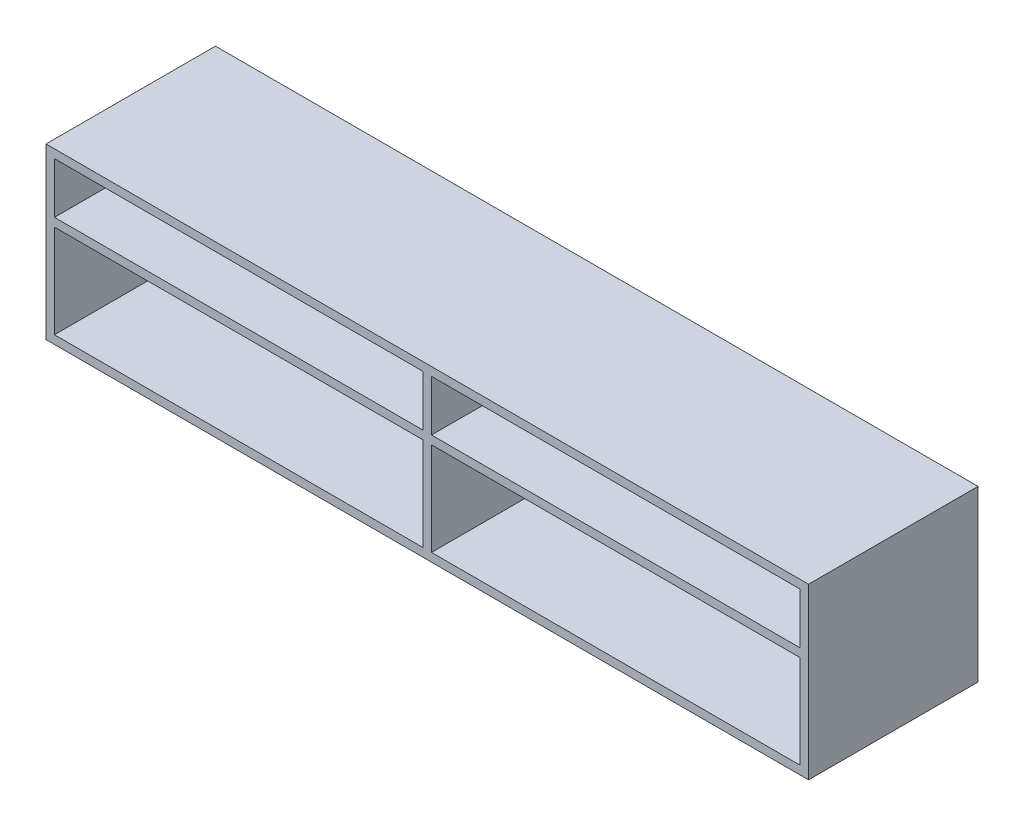
ISO-10303-21;
HEADER;
FILE_DESCRIPTION(('STEP AP214'),'2;1');
FILE_NAME('part.step','',(''),(''),'','','');
FILE_SCHEMA(('AUTOMOTIVE_DESIGN { 1 0 10303 214 1 1 1 1 }'));
ENDSEC;
DATA;
#1=APPLICATION_CONTEXT('core data for automotive mechanical design processes');
#2=APPLICATION_PROTOCOL_DEFINITION('international standard','automotive_design',2000,#1);
#3=PRODUCT_CONTEXT('',#1,'mechanical');
#4=PRODUCT('Part','Part','',(#3));
#5=PRODUCT_RELATED_PRODUCT_CATEGORY('part','',(#4));
#6=PRODUCT_DEFINITION_FORMATION('','',#4);
#7=PRODUCT_DEFINITION_CONTEXT('part definition',#1,'design');
#8=PRODUCT_DEFINITION('design','',#6,#7);
#9=PRODUCT_DEFINITION_SHAPE('','',#8);
#10=(LENGTH_UNIT() NAMED_UNIT(*) SI_UNIT(.MILLI.,.METRE.));
#11=(NAMED_UNIT(*) PLANE_ANGLE_UNIT() SI_UNIT($,.RADIAN.));
#12=(NAMED_UNIT(*) SI_UNIT($,.STERADIAN.) SOLID_ANGLE_UNIT());
#13=UNCERTAINTY_MEASURE_WITH_UNIT(LENGTH_MEASURE(1.E-05),#10,'distance_accuracy_value','');
#14=(GEOMETRIC_REPRESENTATION_CONTEXT(3) GLOBAL_UNCERTAINTY_ASSIGNED_CONTEXT((#13)) GLOBAL_UNIT_ASSIGNED_CONTEXT((#10,
#11,#12)) REPRESENTATION_CONTEXT('',''));
#15=CARTESIAN_POINT('',(0.,0.,0.));
#16=DIRECTION('',(0.,0.,1.));
#17=DIRECTION('',(1.,0.,0.));
#18=AXIS2_PLACEMENT_3D('',#15,#16,#17);
#19=CARTESIAN_POINT('',(0.,0.,400.));
#20=DIRECTION('',(0.,0.,1.));
#21=DIRECTION('',(1.,0.,0.));
#22=AXIS2_PLACEMENT_3D('',#19,#20,#21);
#23=PLANE('',#22);
#24=DIRECTION('',(0.,-1.,0.));
#25=VECTOR('',#24,1.);
#26=CARTESIAN_POINT('',(0.,400.,400.));
#27=LINE('',#26,#25);
#28=CARTESIAN_POINT('',(0.,400.,400.));
#29=VERTEX_POINT('',#28);
#30=CARTESIAN_POINT('',(0.,0.,400.));
#31=VERTEX_POINT('',#30);
#32=EDGE_CURVE('E302',#29,#31,#27,.T.);
#33=ORIENTED_EDGE('',*,*,#32,.T.);
#34=DIRECTION('',(1.,0.,0.));
#35=VECTOR('',#34,1.);
#36=CARTESIAN_POINT('',(0.,0.,400.));
#37=LINE('',#36,#35);
#38=CARTESIAN_POINT('',(1800.,0.,400.));
#39=VERTEX_POINT('',#38);
#40=EDGE_CURVE('E305',#31,#39,#37,.T.);
#41=ORIENTED_EDGE('',*,*,#40,.T.);
#42=DIRECTION('',(0.,1.,0.));
#43=VECTOR('',#42,1.);
#44=CARTESIAN_POINT('',(1800.,0.,400.));
#45=LINE('',#44,#43);
#46=CARTESIAN_POINT('',(1800.,400.,400.));
#47=VERTEX_POINT('',#46);
#48=EDGE_CURVE('E308',#39,#47,#45,.T.);
#49=ORIENTED_EDGE('',*,*,#48,.T.);
#50=DIRECTION('',(-1.,0.,0.));
#51=VECTOR('',#50,1.);
#52=CARTESIAN_POINT('',(1800.,400.,400.));
#53=LINE('',#52,#51);
#54=EDGE_CURVE('E310',#47,#29,#53,.T.);
#55=ORIENTED_EDGE('',*,*,#54,.T.);
#56=EDGE_LOOP('',(#33,#41,#49,#55));
#57=FACE_BOUND('',#56,.T.);
#58=DIRECTION('',(0.,-1.,0.));
#59=VECTOR('',#58,1.);
#60=CARTESIAN_POINT('',(20.,380.,400.));
#61=LINE('',#60,#59);
#62=CARTESIAN_POINT('',(20.,380.,400.));
#63=VERTEX_POINT('',#62);
#64=CARTESIAN_POINT('',(20.,260.,400.));
#65=VERTEX_POINT('',#64);
#66=EDGE_CURVE('E273',#63,#65,#61,.T.);
#67=ORIENTED_EDGE('',*,*,#66,.F.);
#68=DIRECTION('',(-1.,0.,0.));
#69=VECTOR('',#68,1.);
#70=CARTESIAN_POINT('',(890.,380.,400.));
#71=LINE('',#70,#69);
#72=CARTESIAN_POINT('',(890.,380.,400.));
#73=VERTEX_POINT('',#72);
#74=EDGE_CURVE('E271',#73,#63,#71,.T.);
#75=ORIENTED_EDGE('',*,*,#74,.F.);
#76=DIRECTION('',(0.,1.,0.));
#77=VECTOR('',#76,1.);
#78=CARTESIAN_POINT('',(890.,380.,400.));
#79=LINE('',#78,#77);
#80=CARTESIAN_POINT('',(890.,260.,400.));
#81=VERTEX_POINT('',#80);
#82=EDGE_CURVE('E279',#81,#73,#79,.T.);
#83=ORIENTED_EDGE('',*,*,#82,.F.);
#84=DIRECTION('',(1.,0.,0.));
#85=VECTOR('',#84,1.);
#86=CARTESIAN_POINT('',(20.,260.,400.));
#87=LINE('',#86,#85);
#88=EDGE_CURVE('E276',#65,#81,#87,.T.);
#89=ORIENTED_EDGE('',*,*,#88,.F.);
#90=EDGE_LOOP('',(#67,#75,#83,#89));
#91=FACE_BOUND('',#90,.T.);
#92=DIRECTION('',(1.,0.,0.));
#93=VECTOR('',#92,1.);
#94=CARTESIAN_POINT('',(20.,20.,400.));
#95=LINE('',#94,#93);
#96=CARTESIAN_POINT('',(20.,20.,400.));
#97=VERTEX_POINT('',#96);
#98=CARTESIAN_POINT('',(890.,20.,400.));
#99=VERTEX_POINT('',#98);
#100=EDGE_CURVE('E242',#97,#99,#95,.T.);
#101=ORIENTED_EDGE('',*,*,#100,.F.);
#102=DIRECTION('',(0.,-1.,0.));
#103=VECTOR('',#102,1.);
#104=CARTESIAN_POINT('',(20.,240.,400.));
#105=LINE('',#104,#103);
#106=CARTESIAN_POINT('',(20.,240.,400.));
#107=VERTEX_POINT('',#106);
#108=EDGE_CURVE('E240',#107,#97,#105,.T.);
#109=ORIENTED_EDGE('',*,*,#108,.F.);
#110=DIRECTION('',(-1.,0.,0.));
#111=VECTOR('',#110,1.);
#112=CARTESIAN_POINT('',(20.,240.,400.));
#113=LINE('',#112,#111);
#114=CARTESIAN_POINT('',(890.,240.,400.));
#115=VERTEX_POINT('',#114);
#116=EDGE_CURVE('E248',#115,#107,#113,.T.);
#117=ORIENTED_EDGE('',*,*,#116,.F.);
#118=DIRECTION('',(0.,1.,0.));
#119=VECTOR('',#118,1.);
#120=CARTESIAN_POINT('',(890.,240.,400.));
#121=LINE('',#120,#119);
#122=EDGE_CURVE('E245',#99,#115,#121,.T.);
#123=ORIENTED_EDGE('',*,*,#122,.F.);
#124=EDGE_LOOP('',(#101,#109,#117,#123));
#125=FACE_BOUND('',#124,.T.);
#126=DIRECTION('',(0.,1.,0.));
#127=VECTOR('',#126,1.);
#128=CARTESIAN_POINT('',(1780.,20.,400.));
#129=LINE('',#128,#127);
#130=CARTESIAN_POINT('',(1780.,20.,400.));
#131=VERTEX_POINT('',#130);
#132=CARTESIAN_POINT('',(1780.,240.,400.));
#133=VERTEX_POINT('',#132);
#134=EDGE_CURVE('E211',#131,#133,#129,.T.);
#135=ORIENTED_EDGE('',*,*,#134,.F.);
#136=DIRECTION('',(1.,0.,0.));
#137=VECTOR('',#136,1.);
#138=CARTESIAN_POINT('',(910.,20.,400.));
#139=LINE('',#138,#137);
#140=CARTESIAN_POINT('',(910.,20.,400.));
#141=VERTEX_POINT('',#140);
#142=EDGE_CURVE('E209',#141,#131,#139,.T.);
#143=ORIENTED_EDGE('',*,*,#142,.F.);
#144=DIRECTION('',(0.,-1.,0.));
#145=VECTOR('',#144,1.);
#146=CARTESIAN_POINT('',(910.,240.,400.));
#147=LINE('',#146,#145);
#148=CARTESIAN_POINT('',(910.,240.,400.));
#149=VERTEX_POINT('',#148);
#150=EDGE_CURVE('E217',#149,#141,#147,.T.);
#151=ORIENTED_EDGE('',*,*,#150,.F.);
#152=DIRECTION('',(-1.,0.,0.));
#153=VECTOR('',#152,1.);
#154=CARTESIAN_POINT('',(910.,240.,400.));
#155=LINE('',#154,#153);
#156=EDGE_CURVE('E214',#133,#149,#155,.T.);
#157=ORIENTED_EDGE('',*,*,#156,.F.);
#158=EDGE_LOOP('',(#135,#143,#151,#157));
#159=FACE_BOUND('',#158,.T.);
#160=DIRECTION('',(-1.,0.,0.));
#161=VECTOR('',#160,1.);
#162=CARTESIAN_POINT('',(1780.,380.,400.));
#163=LINE('',#162,#161);
#164=CARTESIAN_POINT('',(1780.,380.,400.));
#165=VERTEX_POINT('',#164);
#166=CARTESIAN_POINT('',(910.,380.,400.));
#167=VERTEX_POINT('',#166);
#168=EDGE_CURVE('E181',#165,#167,#163,.T.);
#169=ORIENTED_EDGE('',*,*,#168,.F.);
#170=DIRECTION('',(0.,1.,0.));
#171=VECTOR('',#170,1.);
#172=CARTESIAN_POINT('',(1780.,260.,400.));
#173=LINE('',#172,#171);
#174=CARTESIAN_POINT('',(1780.,260.,400.));
#175=VERTEX_POINT('',#174);
#176=EDGE_CURVE('E173',#175,#165,#173,.T.);
#177=ORIENTED_EDGE('',*,*,#176,.F.);
#178=DIRECTION('',(1.,0.,0.));
#179=VECTOR('',#178,1.);
#180=CARTESIAN_POINT('',(910.,260.,400.));
#181=LINE('',#180,#179);
#182=CARTESIAN_POINT('',(910.,260.,400.));
#183=VERTEX_POINT('',#182);
#184=EDGE_CURVE('E195',#183,#175,#181,.T.);
#185=ORIENTED_EDGE('',*,*,#184,.F.);
#186=DIRECTION('',(0.,-1.,0.));
#187=VECTOR('',#186,1.);
#188=CARTESIAN_POINT('',(910.,380.,400.));
#189=LINE('',#188,#187);
#190=EDGE_CURVE('E193',#167,#183,#189,.T.);
#191=ORIENTED_EDGE('',*,*,#190,.F.);
#192=EDGE_LOOP('',(#169,#177,#185,#191));
#193=FACE_BOUND('',#192,.T.);
#194=ADVANCED_FACE('F36',(#57,#91,#125,#159,#193),#23,.T.);
#195=CARTESIAN_POINT('',(0.,0.,0.));
#196=DIRECTION('',(0.,0.,1.));
#197=DIRECTION('',(1.,0.,0.));
#198=AXIS2_PLACEMENT_3D('',#195,#196,#197);
#199=PLANE('',#198);
#200=DIRECTION('',(1.,0.,0.));
#201=VECTOR('',#200,1.);
#202=CARTESIAN_POINT('',(910.,20.,0.));
#203=LINE('',#202,#201);
#204=CARTESIAN_POINT('',(910.,20.,0.));
#205=VERTEX_POINT('',#204);
#206=CARTESIAN_POINT('',(1780.,20.,0.));
#207=VERTEX_POINT('',#206);
#208=EDGE_CURVE('E189',#205,#207,#203,.T.);
#209=ORIENTED_EDGE('',*,*,#208,.T.);
#210=DIRECTION('',(0.,1.,0.));
#211=VECTOR('',#210,1.);
#212=CARTESIAN_POINT('',(1780.,20.,0.));
#213=LINE('',#212,#211);
#214=CARTESIAN_POINT('',(1780.,240.,0.));
#215=VERTEX_POINT('',#214);
#216=EDGE_CURVE('E222',#207,#215,#213,.T.);
#217=ORIENTED_EDGE('',*,*,#216,.T.);
#218=DIRECTION('',(-1.,0.,0.));
#219=VECTOR('',#218,1.);
#220=CARTESIAN_POINT('',(910.,240.,0.));
#221=LINE('',#220,#219);
#222=CARTESIAN_POINT('',(910.,240.,0.));
#223=VERTEX_POINT('',#222);
#224=EDGE_CURVE('E225',#215,#223,#221,.T.);
#225=ORIENTED_EDGE('',*,*,#224,.T.);
#226=DIRECTION('',(0.,-1.,0.));
#227=VECTOR('',#226,1.);
#228=CARTESIAN_POINT('',(910.,240.,0.));
#229=LINE('',#228,#227);
#230=EDGE_CURVE('E212',#223,#205,#229,.T.);
#231=ORIENTED_EDGE('',*,*,#230,.T.);
#232=EDGE_LOOP('',(#209,#217,#225,#231));
#233=FACE_BOUND('',#232,.T.);
#234=DIRECTION('',(-1.,0.,0.));
#235=VECTOR('',#234,1.);
#236=CARTESIAN_POINT('',(890.,380.,0.));
#237=LINE('',#236,#235);
#238=CARTESIAN_POINT('',(890.,380.,0.));
#239=VERTEX_POINT('',#238);
#240=CARTESIAN_POINT('',(20.,380.,0.));
#241=VERTEX_POINT('',#240);
#242=EDGE_CURVE('E270',#239,#241,#237,.T.);
#243=ORIENTED_EDGE('',*,*,#242,.T.);
#244=DIRECTION('',(0.,-1.,0.));
#245=VECTOR('',#244,1.);
#246=CARTESIAN_POINT('',(20.,380.,0.));
#247=LINE('',#246,#245);
#248=CARTESIAN_POINT('',(20.,260.,0.));
#249=VERTEX_POINT('',#248);
#250=EDGE_CURVE('E284',#241,#249,#247,.T.);
#251=ORIENTED_EDGE('',*,*,#250,.T.);
#252=DIRECTION('',(1.,0.,0.));
#253=VECTOR('',#252,1.);
#254=CARTESIAN_POINT('',(20.,260.,0.));
#255=LINE('',#254,#253);
#256=CARTESIAN_POINT('',(890.,260.,0.));
#257=VERTEX_POINT('',#256);
#258=EDGE_CURVE('E287',#249,#257,#255,.T.);
#259=ORIENTED_EDGE('',*,*,#258,.T.);
#260=DIRECTION('',(0.,1.,0.));
#261=VECTOR('',#260,1.);
#262=CARTESIAN_POINT('',(890.,380.,0.));
#263=LINE('',#262,#261);
#264=EDGE_CURVE('E274',#257,#239,#263,.T.);
#265=ORIENTED_EDGE('',*,*,#264,.T.);
#266=EDGE_LOOP('',(#243,#251,#259,#265));
#267=FACE_BOUND('',#266,.T.);
#268=DIRECTION('',(0.,-1.,0.));
#269=VECTOR('',#268,1.);
#270=CARTESIAN_POINT('',(0.,400.,0.));
#271=LINE('',#270,#269);
#272=CARTESIAN_POINT('',(0.,400.,0.));
#273=VERTEX_POINT('',#272);
#274=CARTESIAN_POINT('',(0.,0.,0.));
#275=VERTEX_POINT('',#274);
#276=EDGE_CURVE('E301',#273,#275,#271,.T.);
#277=ORIENTED_EDGE('',*,*,#276,.F.);
#278=DIRECTION('',(-1.,0.,0.));
#279=VECTOR('',#278,1.);
#280=CARTESIAN_POINT('',(1800.,400.,0.));
#281=LINE('',#280,#279);
#282=CARTESIAN_POINT('',(1800.,400.,0.));
#283=VERTEX_POINT('',#282);
#284=EDGE_CURVE('E306',#283,#273,#281,.T.);
#285=ORIENTED_EDGE('',*,*,#284,.F.);
#286=DIRECTION('',(0.,1.,0.));
#287=VECTOR('',#286,1.);
#288=CARTESIAN_POINT('',(1800.,0.,0.));
#289=LINE('',#288,#287);
#290=CARTESIAN_POINT('',(1800.,0.,0.));
#291=VERTEX_POINT('',#290);
#292=EDGE_CURVE('E317',#291,#283,#289,.T.);
#293=ORIENTED_EDGE('',*,*,#292,.F.);
#294=DIRECTION('',(1.,0.,0.));
#295=VECTOR('',#294,1.);
#296=CARTESIAN_POINT('',(0.,0.,0.));
#297=LINE('',#296,#295);
#298=EDGE_CURVE('E315',#275,#291,#297,.T.);
#299=ORIENTED_EDGE('',*,*,#298,.F.);
#300=EDGE_LOOP('',(#277,#285,#293,#299));
#301=FACE_BOUND('',#300,.T.);
#302=DIRECTION('',(0.,-1.,0.));
#303=VECTOR('',#302,1.);
#304=CARTESIAN_POINT('',(20.,240.,0.));
#305=LINE('',#304,#303);
#306=CARTESIAN_POINT('',(20.,240.,0.));
#307=VERTEX_POINT('',#306);
#308=CARTESIAN_POINT('',(20.,20.,0.));
#309=VERTEX_POINT('',#308);
#310=EDGE_CURVE('E239',#307,#309,#305,.T.);
#311=ORIENTED_EDGE('',*,*,#310,.T.);
#312=DIRECTION('',(1.,0.,0.));
#313=VECTOR('',#312,1.);
#314=CARTESIAN_POINT('',(20.,20.,0.));
#315=LINE('',#314,#313);
#316=CARTESIAN_POINT('',(890.,20.,0.));
#317=VERTEX_POINT('',#316);
#318=EDGE_CURVE('E253',#309,#317,#315,.T.);
#319=ORIENTED_EDGE('',*,*,#318,.T.);
#320=DIRECTION('',(0.,1.,0.));
#321=VECTOR('',#320,1.);
#322=CARTESIAN_POINT('',(890.,240.,0.));
#323=LINE('',#322,#321);
#324=CARTESIAN_POINT('',(890.,240.,0.));
#325=VERTEX_POINT('',#324);
#326=EDGE_CURVE('E256',#317,#325,#323,.T.);
#327=ORIENTED_EDGE('',*,*,#326,.T.);
#328=DIRECTION('',(-1.,0.,0.));
#329=VECTOR('',#328,1.);
#330=CARTESIAN_POINT('',(20.,240.,0.));
#331=LINE('',#330,#329);
#332=EDGE_CURVE('E243',#325,#307,#331,.T.);
#333=ORIENTED_EDGE('',*,*,#332,.T.);
#334=EDGE_LOOP('',(#311,#319,#327,#333));
#335=FACE_BOUND('',#334,.T.);
#336=DIRECTION('',(0.,1.,0.));
#337=VECTOR('',#336,1.);
#338=CARTESIAN_POINT('',(1780.,260.,0.));
#339=LINE('',#338,#337);
#340=CARTESIAN_POINT('',(1780.,260.,0.));
#341=VERTEX_POINT('',#340);
#342=CARTESIAN_POINT('',(1780.,380.,0.));
#343=VERTEX_POINT('',#342);
#344=EDGE_CURVE('E59',#341,#343,#339,.T.);
#345=ORIENTED_EDGE('',*,*,#344,.T.);
#346=DIRECTION('',(-1.,0.,0.));
#347=VECTOR('',#346,1.);
#348=CARTESIAN_POINT('',(1780.,380.,0.));
#349=LINE('',#348,#347);
#350=CARTESIAN_POINT('',(910.,380.,0.));
#351=VERTEX_POINT('',#350);
#352=EDGE_CURVE('E188',#343,#351,#349,.T.);
#353=ORIENTED_EDGE('',*,*,#352,.T.);
#354=DIRECTION('',(0.,-1.,0.));
#355=VECTOR('',#354,1.);
#356=CARTESIAN_POINT('',(910.,380.,0.));
#357=LINE('',#356,#355);
#358=CARTESIAN_POINT('',(910.,260.,0.));
#359=VERTEX_POINT('',#358);
#360=EDGE_CURVE('E201',#351,#359,#357,.T.);
#361=ORIENTED_EDGE('',*,*,#360,.T.);
#362=DIRECTION('',(1.,0.,0.));
#363=VECTOR('',#362,1.);
#364=CARTESIAN_POINT('',(910.,260.,0.));
#365=LINE('',#364,#363);
#366=EDGE_CURVE('E182',#359,#341,#365,.T.);
#367=ORIENTED_EDGE('',*,*,#366,.T.);
#368=EDGE_LOOP('',(#345,#353,#361,#367));
#369=FACE_BOUND('',#368,.T.);
#370=ADVANCED_FACE('F335',(#233,#267,#301,#335,#369),#199,.F.);
#371=CARTESIAN_POINT('',(0.,400.,400.));
#372=DIRECTION('',(1.,0.,0.));
#373=DIRECTION('',(0.,0.,-1.));
#374=AXIS2_PLACEMENT_3D('',#371,#372,#373);
#375=PLANE('',#374);
#376=ORIENTED_EDGE('',*,*,#276,.T.);
#377=DIRECTION('',(0.,0.,-1.));
#378=VECTOR('',#377,1.);
#379=CARTESIAN_POINT('',(0.,0.,400.));
#380=LINE('',#379,#378);
#381=EDGE_CURVE('E11',#31,#275,#380,.T.);
#382=ORIENTED_EDGE('',*,*,#381,.F.);
#383=ORIENTED_EDGE('',*,*,#32,.F.);
#384=DIRECTION('',(0.,0.,-1.));
#385=VECTOR('',#384,1.);
#386=CARTESIAN_POINT('',(0.,400.,400.));
#387=LINE('',#386,#385);
#388=EDGE_CURVE('E312',#29,#273,#387,.T.);
#389=ORIENTED_EDGE('',*,*,#388,.T.);
#390=EDGE_LOOP('',(#376,#382,#383,#389));
#391=FACE_BOUND('',#390,.T.);
#392=ADVANCED_FACE('F38',(#391),#375,.F.);
#393=CARTESIAN_POINT('',(0.,0.,400.));
#394=DIRECTION('',(0.,1.,0.));
#395=DIRECTION('',(0.,0.,1.));
#396=AXIS2_PLACEMENT_3D('',#393,#394,#395);
#397=PLANE('',#396);
#398=ORIENTED_EDGE('',*,*,#298,.T.);
#399=DIRECTION('',(0.,0.,-1.));
#400=VECTOR('',#399,1.);
#401=CARTESIAN_POINT('',(1800.,0.,400.));
#402=LINE('',#401,#400);
#403=EDGE_CURVE('E44',#39,#291,#402,.T.);
#404=ORIENTED_EDGE('',*,*,#403,.F.);
#405=ORIENTED_EDGE('',*,*,#40,.F.);
#406=ORIENTED_EDGE('',*,*,#381,.T.);
#407=EDGE_LOOP('',(#398,#404,#405,#406));
#408=FACE_BOUND('',#407,.T.);
#409=ADVANCED_FACE('F346',(#408),#397,.F.);
#410=CARTESIAN_POINT('',(1800.,0.,400.));
#411=DIRECTION('',(-1.,0.,0.));
#412=DIRECTION('',(0.,0.,1.));
#413=AXIS2_PLACEMENT_3D('',#410,#411,#412);
#414=PLANE('',#413);
#415=ORIENTED_EDGE('',*,*,#292,.T.);
#416=DIRECTION('',(0.,0.,-1.));
#417=VECTOR('',#416,1.);
#418=CARTESIAN_POINT('',(1800.,400.,400.));
#419=LINE('',#418,#417);
#420=EDGE_CURVE('E322',#47,#283,#419,.T.);
#421=ORIENTED_EDGE('',*,*,#420,.F.);
#422=ORIENTED_EDGE('',*,*,#48,.F.);
#423=ORIENTED_EDGE('',*,*,#403,.T.);
#424=EDGE_LOOP('',(#415,#421,#422,#423));
#425=FACE_BOUND('',#424,.T.);
#426=ADVANCED_FACE('F329',(#425),#414,.F.);
#427=CARTESIAN_POINT('',(1800.,400.,400.));
#428=DIRECTION('',(0.,-1.,0.));
#429=DIRECTION('',(1.,0.,0.));
#430=AXIS2_PLACEMENT_3D('',#427,#428,#429);
#431=PLANE('',#430);
#432=ORIENTED_EDGE('',*,*,#284,.T.);
#433=ORIENTED_EDGE('',*,*,#388,.F.);
#434=ORIENTED_EDGE('',*,*,#54,.F.);
#435=ORIENTED_EDGE('',*,*,#420,.T.);
#436=EDGE_LOOP('',(#432,#433,#434,#435));
#437=FACE_BOUND('',#436,.T.);
#438=ADVANCED_FACE('F339',(#437),#431,.F.);
#439=CARTESIAN_POINT('',(890.,380.,400.));
#440=DIRECTION('',(0.,-1.,0.));
#441=DIRECTION('',(1.,0.,0.));
#442=AXIS2_PLACEMENT_3D('',#439,#440,#441);
#443=PLANE('',#442);
#444=ORIENTED_EDGE('',*,*,#242,.F.);
#445=DIRECTION('',(0.,0.,-1.));
#446=VECTOR('',#445,1.);
#447=CARTESIAN_POINT('',(890.,380.,400.));
#448=LINE('',#447,#446);
#449=EDGE_CURVE('E281',#73,#239,#448,.T.);
#450=ORIENTED_EDGE('',*,*,#449,.F.);
#451=ORIENTED_EDGE('',*,*,#74,.T.);
#452=DIRECTION('',(0.,0.,-1.));
#453=VECTOR('',#452,1.);
#454=CARTESIAN_POINT('',(20.,380.,400.));
#455=LINE('',#454,#453);
#456=EDGE_CURVE('E298',#63,#241,#455,.T.);
#457=ORIENTED_EDGE('',*,*,#456,.T.);
#458=EDGE_LOOP('',(#444,#450,#451,#457));
#459=FACE_BOUND('',#458,.T.);
#460=ADVANCED_FACE('F361',(#459),#443,.T.);
#461=CARTESIAN_POINT('',(20.,380.,400.));
#462=DIRECTION('',(1.,0.,0.));
#463=DIRECTION('',(0.,1.,0.));
#464=AXIS2_PLACEMENT_3D('',#461,#462,#463);
#465=PLANE('',#464);
#466=ORIENTED_EDGE('',*,*,#250,.F.);
#467=ORIENTED_EDGE('',*,*,#456,.F.);
#468=ORIENTED_EDGE('',*,*,#66,.T.);
#469=DIRECTION('',(0.,0.,-1.));
#470=VECTOR('',#469,1.);
#471=CARTESIAN_POINT('',(20.,260.,400.));
#472=LINE('',#471,#470);
#473=EDGE_CURVE('E296',#65,#249,#472,.T.);
#474=ORIENTED_EDGE('',*,*,#473,.T.);
#475=EDGE_LOOP('',(#466,#467,#468,#474));
#476=FACE_BOUND('',#475,.T.);
#477=ADVANCED_FACE('F368',(#476),#465,.T.);
#478=CARTESIAN_POINT('',(20.,260.,400.));
#479=DIRECTION('',(0.,1.,0.));
#480=DIRECTION('',(0.,0.,1.));
#481=AXIS2_PLACEMENT_3D('',#478,#479,#480);
#482=PLANE('',#481);
#483=ORIENTED_EDGE('',*,*,#258,.F.);
#484=ORIENTED_EDGE('',*,*,#473,.F.);
#485=ORIENTED_EDGE('',*,*,#88,.T.);
#486=DIRECTION('',(0.,0.,-1.));
#487=VECTOR('',#486,1.);
#488=CARTESIAN_POINT('',(890.,260.,400.));
#489=LINE('',#488,#487);
#490=EDGE_CURVE('E294',#81,#257,#489,.T.);
#491=ORIENTED_EDGE('',*,*,#490,.T.);
#492=EDGE_LOOP('',(#483,#484,#485,#491));
#493=FACE_BOUND('',#492,.T.);
#494=ADVANCED_FACE('F373',(#493),#482,.T.);
#495=CARTESIAN_POINT('',(890.,380.,400.));
#496=DIRECTION('',(-1.,0.,0.));
#497=DIRECTION('',(0.,0.,1.));
#498=AXIS2_PLACEMENT_3D('',#495,#496,#497);
#499=PLANE('',#498);
#500=ORIENTED_EDGE('',*,*,#264,.F.);
#501=ORIENTED_EDGE('',*,*,#490,.F.);
#502=ORIENTED_EDGE('',*,*,#82,.T.);
#503=ORIENTED_EDGE('',*,*,#449,.T.);
#504=EDGE_LOOP('',(#500,#501,#502,#503));
#505=FACE_BOUND('',#504,.T.);
#506=ADVANCED_FACE('F381',(#505),#499,.T.);
#507=CARTESIAN_POINT('',(20.,240.,400.));
#508=DIRECTION('',(1.,0.,0.));
#509=DIRECTION('',(0.,0.,-1.));
#510=AXIS2_PLACEMENT_3D('',#507,#508,#509);
#511=PLANE('',#510);
#512=ORIENTED_EDGE('',*,*,#310,.F.);
#513=DIRECTION('',(0.,0.,-1.));
#514=VECTOR('',#513,1.);
#515=CARTESIAN_POINT('',(20.,240.,400.));
#516=LINE('',#515,#514);
#517=EDGE_CURVE('E250',#107,#307,#516,.T.);
#518=ORIENTED_EDGE('',*,*,#517,.F.);
#519=ORIENTED_EDGE('',*,*,#108,.T.);
#520=DIRECTION('',(0.,0.,-1.));
#521=VECTOR('',#520,1.);
#522=CARTESIAN_POINT('',(20.,20.,400.));
#523=LINE('',#522,#521);
#524=EDGE_CURVE('E267',#97,#309,#523,.T.);
#525=ORIENTED_EDGE('',*,*,#524,.T.);
#526=EDGE_LOOP('',(#512,#518,#519,#525));
#527=FACE_BOUND('',#526,.T.);
#528=ADVANCED_FACE('F435',(#527),#511,.T.);
#529=CARTESIAN_POINT('',(20.,20.,400.));
#530=DIRECTION('',(0.,1.,0.));
#531=DIRECTION('',(-1.,0.,0.));
#532=AXIS2_PLACEMENT_3D('',#529,#530,#531);
#533=PLANE('',#532);
#534=ORIENTED_EDGE('',*,*,#318,.F.);
#535=ORIENTED_EDGE('',*,*,#524,.F.);
#536=ORIENTED_EDGE('',*,*,#100,.T.);
#537=DIRECTION('',(0.,0.,-1.));
#538=VECTOR('',#537,1.);
#539=CARTESIAN_POINT('',(890.,20.,400.));
#540=LINE('',#539,#538);
#541=EDGE_CURVE('E265',#99,#317,#540,.T.);
#542=ORIENTED_EDGE('',*,*,#541,.T.);
#543=EDGE_LOOP('',(#534,#535,#536,#542));
#544=FACE_BOUND('',#543,.T.);
#545=ADVANCED_FACE('F431',(#544),#533,.T.);
#546=CARTESIAN_POINT('',(890.,240.,400.));
#547=DIRECTION('',(-1.,0.,0.));
#548=DIRECTION('',(0.,0.,1.));
#549=AXIS2_PLACEMENT_3D('',#546,#547,#548);
#550=PLANE('',#549);
#551=ORIENTED_EDGE('',*,*,#326,.F.);
#552=ORIENTED_EDGE('',*,*,#541,.F.);
#553=ORIENTED_EDGE('',*,*,#122,.T.);
#554=DIRECTION('',(0.,0.,-1.));
#555=VECTOR('',#554,1.);
#556=CARTESIAN_POINT('',(890.,240.,400.));
#557=LINE('',#556,#555);
#558=EDGE_CURVE('E263',#115,#325,#557,.T.);
#559=ORIENTED_EDGE('',*,*,#558,.T.);
#560=EDGE_LOOP('',(#551,#552,#553,#559));
#561=FACE_BOUND('',#560,.T.);
#562=ADVANCED_FACE('F427',(#561),#550,.T.);
#563=CARTESIAN_POINT('',(20.,240.,400.));
#564=DIRECTION('',(0.,-1.,0.));
#565=DIRECTION('',(0.,0.,-1.));
#566=AXIS2_PLACEMENT_3D('',#563,#564,#565);
#567=PLANE('',#566);
#568=ORIENTED_EDGE('',*,*,#332,.F.);
#569=ORIENTED_EDGE('',*,*,#558,.F.);
#570=ORIENTED_EDGE('',*,*,#116,.T.);
#571=ORIENTED_EDGE('',*,*,#517,.T.);
#572=EDGE_LOOP('',(#568,#569,#570,#571));
#573=FACE_BOUND('',#572,.T.);
#574=ADVANCED_FACE('F424',(#573),#567,.T.);
#575=CARTESIAN_POINT('',(910.,20.,400.));
#576=DIRECTION('',(0.,1.,0.));
#577=DIRECTION('',(-1.,0.,0.));
#578=AXIS2_PLACEMENT_3D('',#575,#576,#577);
#579=PLANE('',#578);
#580=ORIENTED_EDGE('',*,*,#208,.F.);
#581=DIRECTION('',(0.,0.,-1.));
#582=VECTOR('',#581,1.);
#583=CARTESIAN_POINT('',(910.,20.,400.));
#584=LINE('',#583,#582);
#585=EDGE_CURVE('E219',#141,#205,#584,.T.);
#586=ORIENTED_EDGE('',*,*,#585,.F.);
#587=ORIENTED_EDGE('',*,*,#142,.T.);
#588=DIRECTION('',(0.,0.,-1.));
#589=VECTOR('',#588,1.);
#590=CARTESIAN_POINT('',(1780.,20.,400.));
#591=LINE('',#590,#589);
#592=EDGE_CURVE('E236',#131,#207,#591,.T.);
#593=ORIENTED_EDGE('',*,*,#592,.T.);
#594=EDGE_LOOP('',(#580,#586,#587,#593));
#595=FACE_BOUND('',#594,.T.);
#596=ADVANCED_FACE('F406',(#595),#579,.T.);
#597=CARTESIAN_POINT('',(1780.,20.,400.));
#598=DIRECTION('',(-1.,0.,0.));
#599=DIRECTION('',(0.,0.,1.));
#600=AXIS2_PLACEMENT_3D('',#597,#598,#599);
#601=PLANE('',#600);
#602=ORIENTED_EDGE('',*,*,#216,.F.);
#603=ORIENTED_EDGE('',*,*,#592,.F.);
#604=ORIENTED_EDGE('',*,*,#134,.T.);
#605=DIRECTION('',(0.,0.,-1.));
#606=VECTOR('',#605,1.);
#607=CARTESIAN_POINT('',(1780.,240.,400.));
#608=LINE('',#607,#606);
#609=EDGE_CURVE('E234',#133,#215,#608,.T.);
#610=ORIENTED_EDGE('',*,*,#609,.T.);
#611=EDGE_LOOP('',(#602,#603,#604,#610));
#612=FACE_BOUND('',#611,.T.);
#613=ADVANCED_FACE('F400',(#612),#601,.T.);
#614=CARTESIAN_POINT('',(910.,240.,400.));
#615=DIRECTION('',(0.,-1.,0.));
#616=DIRECTION('',(0.,0.,-1.));
#617=AXIS2_PLACEMENT_3D('',#614,#615,#616);
#618=PLANE('',#617);
#619=ORIENTED_EDGE('',*,*,#224,.F.);
#620=ORIENTED_EDGE('',*,*,#609,.F.);
#621=ORIENTED_EDGE('',*,*,#156,.T.);
#622=DIRECTION('',(0.,0.,-1.));
#623=VECTOR('',#622,1.);
#624=CARTESIAN_POINT('',(910.,240.,400.));
#625=LINE('',#624,#623);
#626=EDGE_CURVE('E232',#149,#223,#625,.T.);
#627=ORIENTED_EDGE('',*,*,#626,.T.);
#628=EDGE_LOOP('',(#619,#620,#621,#627));
#629=FACE_BOUND('',#628,.T.);
#630=ADVANCED_FACE('F403',(#629),#618,.T.);
#631=CARTESIAN_POINT('',(910.,240.,400.));
#632=DIRECTION('',(1.,0.,0.));
#633=DIRECTION('',(0.,0.,-1.));
#634=AXIS2_PLACEMENT_3D('',#631,#632,#633);
#635=PLANE('',#634);
#636=ORIENTED_EDGE('',*,*,#230,.F.);
#637=ORIENTED_EDGE('',*,*,#626,.F.);
#638=ORIENTED_EDGE('',*,*,#150,.T.);
#639=ORIENTED_EDGE('',*,*,#585,.T.);
#640=EDGE_LOOP('',(#636,#637,#638,#639));
#641=FACE_BOUND('',#640,.T.);
#642=ADVANCED_FACE('F409',(#641),#635,.T.);
#643=CARTESIAN_POINT('',(1780.,260.,400.));
#644=DIRECTION('',(-1.,0.,0.));
#645=DIRECTION('',(0.,0.,1.));
#646=AXIS2_PLACEMENT_3D('',#643,#644,#645);
#647=PLANE('',#646);
#648=ORIENTED_EDGE('',*,*,#344,.F.);
#649=DIRECTION('',(0.,0.,-1.));
#650=VECTOR('',#649,1.);
#651=CARTESIAN_POINT('',(1780.,260.,400.));
#652=LINE('',#651,#650);
#653=EDGE_CURVE('E177',#175,#341,#652,.T.);
#654=ORIENTED_EDGE('',*,*,#653,.F.);
#655=ORIENTED_EDGE('',*,*,#176,.T.);
#656=DIRECTION('',(0.,0.,-1.));
#657=VECTOR('',#656,1.);
#658=CARTESIAN_POINT('',(1780.,380.,400.));
#659=LINE('',#658,#657);
#660=EDGE_CURVE('E176',#165,#343,#659,.T.);
#661=ORIENTED_EDGE('',*,*,#660,.T.);
#662=EDGE_LOOP('',(#648,#654,#655,#661));
#663=FACE_BOUND('',#662,.T.);
#664=ADVANCED_FACE('F175',(#663),#647,.T.);
#665=CARTESIAN_POINT('',(1780.,380.,400.));
#666=DIRECTION('',(0.,-1.,0.));
#667=DIRECTION('',(1.,0.,0.));
#668=AXIS2_PLACEMENT_3D('',#665,#666,#667);
#669=PLANE('',#668);
#670=ORIENTED_EDGE('',*,*,#352,.F.);
#671=ORIENTED_EDGE('',*,*,#660,.F.);
#672=ORIENTED_EDGE('',*,*,#168,.T.);
#673=DIRECTION('',(0.,0.,-1.));
#674=VECTOR('',#673,1.);
#675=CARTESIAN_POINT('',(910.,380.,400.));
#676=LINE('',#675,#674);
#677=EDGE_CURVE('E190',#167,#351,#676,.T.);
#678=ORIENTED_EDGE('',*,*,#677,.T.);
#679=EDGE_LOOP('',(#670,#671,#672,#678));
#680=FACE_BOUND('',#679,.T.);
#681=ADVANCED_FACE('F185',(#680),#669,.T.);
#682=CARTESIAN_POINT('',(910.,380.,400.));
#683=DIRECTION('',(1.,0.,0.));
#684=DIRECTION('',(0.,0.,-1.));
#685=AXIS2_PLACEMENT_3D('',#682,#683,#684);
#686=PLANE('',#685);
#687=ORIENTED_EDGE('',*,*,#360,.F.);
#688=ORIENTED_EDGE('',*,*,#677,.F.);
#689=ORIENTED_EDGE('',*,*,#190,.T.);
#690=DIRECTION('',(0.,0.,-1.));
#691=VECTOR('',#690,1.);
#692=CARTESIAN_POINT('',(910.,260.,400.));
#693=LINE('',#692,#691);
#694=EDGE_CURVE('E51',#183,#359,#693,.T.);
#695=ORIENTED_EDGE('',*,*,#694,.T.);
#696=EDGE_LOOP('',(#687,#688,#689,#695));
#697=FACE_BOUND('',#696,.T.);
#698=ADVANCED_FACE('F498',(#697),#686,.T.);
#699=CARTESIAN_POINT('',(910.,260.,400.));
#700=DIRECTION('',(0.,1.,0.));
#701=DIRECTION('',(0.,0.,1.));
#702=AXIS2_PLACEMENT_3D('',#699,#700,#701);
#703=PLANE('',#702);
#704=ORIENTED_EDGE('',*,*,#366,.F.);
#705=ORIENTED_EDGE('',*,*,#694,.F.);
#706=ORIENTED_EDGE('',*,*,#184,.T.);
#707=ORIENTED_EDGE('',*,*,#653,.T.);
#708=EDGE_LOOP('',(#704,#705,#706,#707));
#709=FACE_BOUND('',#708,.T.);
#710=ADVANCED_FACE('F506',(#709),#703,.T.);
#711=CLOSED_SHELL('',(#194,#370,#392,#409,#426,#438,#460,#477,#494,#506,#528,#545,#562,#574,
#596,#613,#630,#642,#664,#681,#698,#710));
#712=MANIFOLD_SOLID_BREP('B2',#711);
#713=ADVANCED_BREP_SHAPE_REPRESENTATION('',(#18,#712),#14);
#714=SHAPE_DEFINITION_REPRESENTATION(#9,#713);
ENDSEC;
END-ISO-10303-21;
